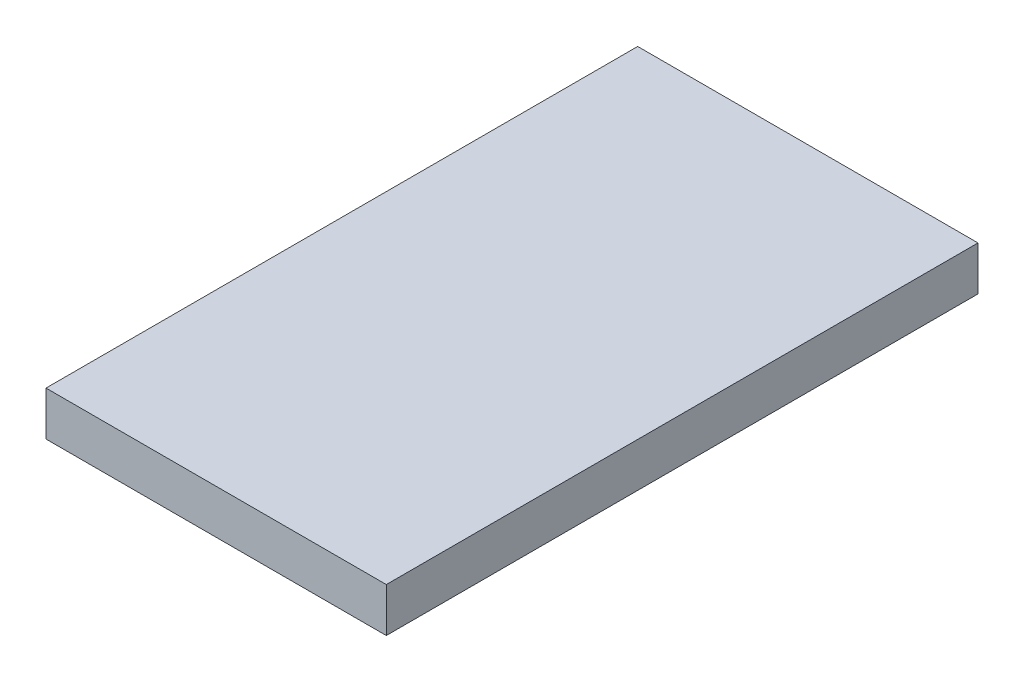
ISO-10303-21;
HEADER;
FILE_DESCRIPTION(('STEP AP214'),'2;1');
FILE_NAME('part.step','',(''),(''),'','','');
FILE_SCHEMA(('AUTOMOTIVE_DESIGN { 1 0 10303 214 1 1 1 1 }'));
ENDSEC;
DATA;
#1=APPLICATION_CONTEXT('core data for automotive mechanical design processes');
#2=APPLICATION_PROTOCOL_DEFINITION('international standard','automotive_design',2000,#1);
#3=PRODUCT_CONTEXT('',#1,'mechanical');
#4=PRODUCT('Part','Part','',(#3));
#5=PRODUCT_RELATED_PRODUCT_CATEGORY('part','',(#4));
#6=PRODUCT_DEFINITION_FORMATION('','',#4);
#7=PRODUCT_DEFINITION_CONTEXT('part definition',#1,'design');
#8=PRODUCT_DEFINITION('design','',#6,#7);
#9=PRODUCT_DEFINITION_SHAPE('','',#8);
#10=(LENGTH_UNIT() NAMED_UNIT(*) SI_UNIT(.MILLI.,.METRE.));
#11=(NAMED_UNIT(*) PLANE_ANGLE_UNIT() SI_UNIT($,.RADIAN.));
#12=(NAMED_UNIT(*) SI_UNIT($,.STERADIAN.) SOLID_ANGLE_UNIT());
#13=UNCERTAINTY_MEASURE_WITH_UNIT(LENGTH_MEASURE(1.E-05),#10,'distance_accuracy_value','');
#14=(GEOMETRIC_REPRESENTATION_CONTEXT(3) GLOBAL_UNCERTAINTY_ASSIGNED_CONTEXT((#13)) GLOBAL_UNIT_ASSIGNED_CONTEXT((#10,
#11,#12)) REPRESENTATION_CONTEXT('',''));
#15=CARTESIAN_POINT('',(0.,0.,0.));
#16=DIRECTION('',(0.,0.,1.));
#17=DIRECTION('',(1.,0.,0.));
#18=AXIS2_PLACEMENT_3D('',#15,#16,#17);
#19=CARTESIAN_POINT('',(0.,7.58525779628945,101.6));
#20=DIRECTION('',(1.,0.,0.));
#21=DIRECTION('',(0.,0.,-1.));
#22=AXIS2_PLACEMENT_3D('',#19,#20,#21);
#23=PLANE('',#22);
#24=DIRECTION('',(0.,-1.,0.));
#25=VECTOR('',#24,1.);
#26=CARTESIAN_POINT('',(0.,7.58525779628945,0.));
#27=LINE('',#26,#25);
#28=CARTESIAN_POINT('',(0.,7.58525779628945,0.));
#29=VERTEX_POINT('',#28);
#30=CARTESIAN_POINT('',(0.,0.,0.));
#31=VERTEX_POINT('',#30);
#32=EDGE_CURVE('E94',#29,#31,#27,.T.);
#33=ORIENTED_EDGE('',*,*,#32,.T.);
#34=DIRECTION('',(0.,0.,-1.));
#35=VECTOR('',#34,1.);
#36=CARTESIAN_POINT('',(0.,0.,101.6));
#37=LINE('',#36,#35);
#38=CARTESIAN_POINT('',(0.,0.,101.6));
#39=VERTEX_POINT('',#38);
#40=EDGE_CURVE('E11',#39,#31,#37,.T.);
#41=ORIENTED_EDGE('',*,*,#40,.F.);
#42=DIRECTION('',(0.,-1.,0.));
#43=VECTOR('',#42,1.);
#44=CARTESIAN_POINT('',(0.,7.58525779628945,101.6));
#45=LINE('',#44,#43);
#46=CARTESIAN_POINT('',(0.,7.58525779628945,101.6));
#47=VERTEX_POINT('',#46);
#48=EDGE_CURVE('E82',#47,#39,#45,.T.);
#49=ORIENTED_EDGE('',*,*,#48,.F.);
#50=DIRECTION('',(0.,0.,-1.));
#51=VECTOR('',#50,1.);
#52=CARTESIAN_POINT('',(0.,7.58525779628945,101.6));
#53=LINE('',#52,#51);
#54=EDGE_CURVE('E90',#47,#29,#53,.T.);
#55=ORIENTED_EDGE('',*,*,#54,.T.);
#56=EDGE_LOOP('',(#33,#41,#49,#55));
#57=FACE_BOUND('',#56,.T.);
#58=ADVANCED_FACE('F31',(#57),#23,.F.);
#59=CARTESIAN_POINT('',(0.,0.,101.6));
#60=DIRECTION('',(0.,1.,0.));
#61=DIRECTION('',(0.,0.,1.));
#62=AXIS2_PLACEMENT_3D('',#59,#60,#61);
#63=PLANE('',#62);
#64=DIRECTION('',(1.,0.,0.));
#65=VECTOR('',#64,1.);
#66=CARTESIAN_POINT('',(0.,0.,0.));
#67=LINE('',#66,#65);
#68=CARTESIAN_POINT('',(58.435046082405,0.,0.));
#69=VERTEX_POINT('',#68);
#70=EDGE_CURVE('E86',#31,#69,#67,.T.);
#71=ORIENTED_EDGE('',*,*,#70,.T.);
#72=DIRECTION('',(0.,0.,-1.));
#73=VECTOR('',#72,1.);
#74=CARTESIAN_POINT('',(58.435046082405,0.,101.6));
#75=LINE('',#74,#73);
#76=CARTESIAN_POINT('',(58.435046082405,0.,101.6));
#77=VERTEX_POINT('',#76);
#78=EDGE_CURVE('E39',#77,#69,#75,.T.);
#79=ORIENTED_EDGE('',*,*,#78,.F.);
#80=DIRECTION('',(1.,0.,0.));
#81=VECTOR('',#80,1.);
#82=CARTESIAN_POINT('',(0.,0.,101.6));
#83=LINE('',#82,#81);
#84=EDGE_CURVE('E77',#39,#77,#83,.T.);
#85=ORIENTED_EDGE('',*,*,#84,.F.);
#86=ORIENTED_EDGE('',*,*,#40,.T.);
#87=EDGE_LOOP('',(#71,#79,#85,#86));
#88=FACE_BOUND('',#87,.T.);
#89=ADVANCED_FACE('F85',(#88),#63,.F.);
#90=CARTESIAN_POINT('',(58.435046082405,0.,101.6));
#91=DIRECTION('',(-1.,0.,0.));
#92=DIRECTION('',(0.,0.,1.));
#93=AXIS2_PLACEMENT_3D('',#90,#91,#92);
#94=PLANE('',#93);
#95=DIRECTION('',(0.,1.,0.));
#96=VECTOR('',#95,1.);
#97=CARTESIAN_POINT('',(58.435046082405,0.,0.));
#98=LINE('',#97,#96);
#99=CARTESIAN_POINT('',(58.435046082405,7.58525779628945,0.));
#100=VERTEX_POINT('',#99);
#101=EDGE_CURVE('E64',#69,#100,#98,.T.);
#102=ORIENTED_EDGE('',*,*,#101,.T.);
#103=DIRECTION('',(0.,0.,-1.));
#104=VECTOR('',#103,1.);
#105=CARTESIAN_POINT('',(58.435046082405,7.58525779628945,101.6));
#106=LINE('',#105,#104);
#107=CARTESIAN_POINT('',(58.435046082405,7.58525779628945,101.6));
#108=VERTEX_POINT('',#107);
#109=EDGE_CURVE('E87',#108,#100,#106,.T.);
#110=ORIENTED_EDGE('',*,*,#109,.F.);
#111=DIRECTION('',(0.,1.,0.));
#112=VECTOR('',#111,1.);
#113=CARTESIAN_POINT('',(58.435046082405,0.,101.6));
#114=LINE('',#113,#112);
#115=EDGE_CURVE('E80',#77,#108,#114,.T.);
#116=ORIENTED_EDGE('',*,*,#115,.F.);
#117=ORIENTED_EDGE('',*,*,#78,.T.);
#118=EDGE_LOOP('',(#102,#110,#116,#117));
#119=FACE_BOUND('',#118,.T.);
#120=ADVANCED_FACE('F88',(#119),#94,.F.);
#121=CARTESIAN_POINT('',(58.435046082405,7.58525779628945,101.6));
#122=DIRECTION('',(0.,-1.,0.));
#123=DIRECTION('',(0.,0.,-1.));
#124=AXIS2_PLACEMENT_3D('',#121,#122,#123);
#125=PLANE('',#124);
#126=DIRECTION('',(-1.,0.,0.));
#127=VECTOR('',#126,1.);
#128=CARTESIAN_POINT('',(58.435046082405,7.58525779628945,0.));
#129=LINE('',#128,#127);
#130=EDGE_CURVE('E70',#100,#29,#129,.T.);
#131=ORIENTED_EDGE('',*,*,#130,.T.);
#132=ORIENTED_EDGE('',*,*,#54,.F.);
#133=DIRECTION('',(-1.,0.,0.));
#134=VECTOR('',#133,1.);
#135=CARTESIAN_POINT('',(58.435046082405,7.58525779628945,101.6));
#136=LINE('',#135,#134);
#137=EDGE_CURVE('E47',#108,#47,#136,.T.);
#138=ORIENTED_EDGE('',*,*,#137,.F.);
#139=ORIENTED_EDGE('',*,*,#109,.T.);
#140=EDGE_LOOP('',(#131,#132,#138,#139));
#141=FACE_BOUND('',#140,.T.);
#142=ADVANCED_FACE('F101',(#141),#125,.F.);
#143=CARTESIAN_POINT('',(0.,0.,101.6));
#144=DIRECTION('',(0.,0.,1.));
#145=DIRECTION('',(1.,0.,0.));
#146=AXIS2_PLACEMENT_3D('',#143,#144,#145);
#147=PLANE('',#146);
#148=ORIENTED_EDGE('',*,*,#48,.T.);
#149=ORIENTED_EDGE('',*,*,#84,.T.);
#150=ORIENTED_EDGE('',*,*,#115,.T.);
#151=ORIENTED_EDGE('',*,*,#137,.T.);
#152=EDGE_LOOP('',(#148,#149,#150,#151));
#153=FACE_BOUND('',#152,.T.);
#154=ADVANCED_FACE('F78',(#153),#147,.T.);
#155=CARTESIAN_POINT('',(0.,0.,0.));
#156=DIRECTION('',(0.,0.,1.));
#157=DIRECTION('',(1.,0.,0.));
#158=AXIS2_PLACEMENT_3D('',#155,#156,#157);
#159=PLANE('',#158);
#160=ORIENTED_EDGE('',*,*,#32,.F.);
#161=ORIENTED_EDGE('',*,*,#130,.F.);
#162=ORIENTED_EDGE('',*,*,#101,.F.);
#163=ORIENTED_EDGE('',*,*,#70,.F.);
#164=EDGE_LOOP('',(#160,#161,#162,#163));
#165=FACE_BOUND('',#164,.T.);
#166=ADVANCED_FACE('F104',(#165),#159,.F.);
#167=CLOSED_SHELL('',(#58,#89,#120,#142,#154,#166));
#168=MANIFOLD_SOLID_BREP('B2',#167);
#169=ADVANCED_BREP_SHAPE_REPRESENTATION('',(#18,#168),#14);
#170=SHAPE_DEFINITION_REPRESENTATION(#9,#169);
ENDSEC;
END-ISO-10303-21;
